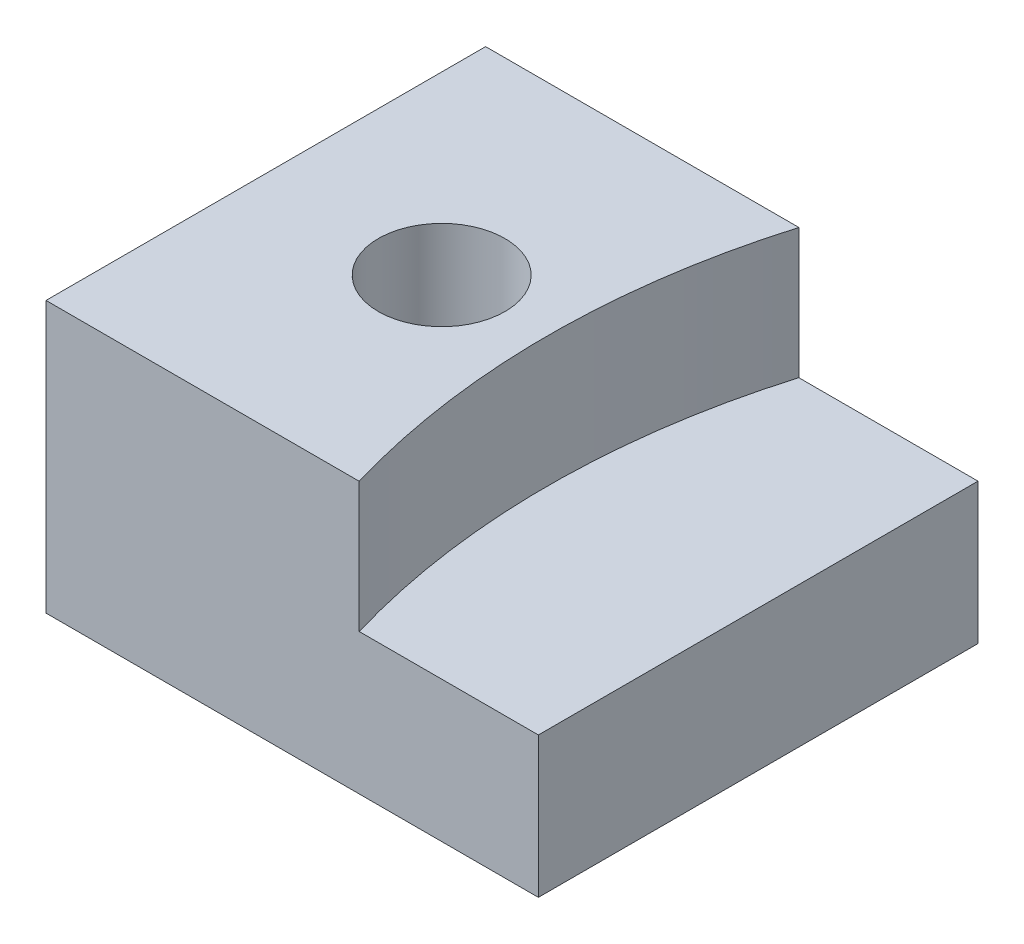
ISO-10303-21;
HEADER;
FILE_DESCRIPTION(('STEP AP214'),'2;1');
FILE_NAME('part.step','',(''),(''),'','','');
FILE_SCHEMA(('AUTOMOTIVE_DESIGN { 1 0 10303 214 1 1 1 1 }'));
ENDSEC;
DATA;
#1=APPLICATION_CONTEXT('core data for automotive mechanical design processes');
#2=APPLICATION_PROTOCOL_DEFINITION('international standard','automotive_design',2000,#1);
#3=PRODUCT_CONTEXT('',#1,'mechanical');
#4=PRODUCT('Part','Part','',(#3));
#5=PRODUCT_RELATED_PRODUCT_CATEGORY('part','',(#4));
#6=PRODUCT_DEFINITION_FORMATION('','',#4);
#7=PRODUCT_DEFINITION_CONTEXT('part definition',#1,'design');
#8=PRODUCT_DEFINITION('design','',#6,#7);
#9=PRODUCT_DEFINITION_SHAPE('','',#8);
#10=(LENGTH_UNIT() NAMED_UNIT(*) SI_UNIT(.MILLI.,.METRE.));
#11=(NAMED_UNIT(*) PLANE_ANGLE_UNIT() SI_UNIT($,.RADIAN.));
#12=(NAMED_UNIT(*) SI_UNIT($,.STERADIAN.) SOLID_ANGLE_UNIT());
#13=UNCERTAINTY_MEASURE_WITH_UNIT(LENGTH_MEASURE(1.E-05),#10,'distance_accuracy_value','');
#14=(GEOMETRIC_REPRESENTATION_CONTEXT(3) GLOBAL_UNCERTAINTY_ASSIGNED_CONTEXT((#13)) GLOBAL_UNIT_ASSIGNED_CONTEXT((#10,
#11,#12)) REPRESENTATION_CONTEXT('',''));
#15=CARTESIAN_POINT('',(0.,0.,0.));
#16=DIRECTION('',(0.,0.,1.));
#17=DIRECTION('',(1.,0.,0.));
#18=AXIS2_PLACEMENT_3D('',#15,#16,#17);
#19=CARTESIAN_POINT('',(0.,2.,0.));
#20=DIRECTION('',(0.,-1.,0.));
#21=DIRECTION('',(0.,0.,-1.));
#22=AXIS2_PLACEMENT_3D('',#19,#20,#21);
#23=PLANE('',#22);
#24=CARTESIAN_POINT('',(12.5,2.,0.));
#25=DIRECTION('',(0.,-1.,0.));
#26=DIRECTION('',(0.,0.,-1.));
#27=AXIS2_PLACEMENT_3D('',#24,#25,#26);
#28=CIRCLE('',#27,11.);
#29=CARTESIAN_POINT('',(1.95322916718108,2.,3.125));
#30=VERTEX_POINT('',#29);
#31=CARTESIAN_POINT('',(1.95322916718107,2.,-3.12499999999999));
#32=VERTEX_POINT('',#31);
#33=EDGE_CURVE('E50',#30,#32,#28,.T.);
#34=ORIENTED_EDGE('',*,*,#33,.F.);
#35=DIRECTION('',(1.,0.,0.));
#36=VECTOR('',#35,1.);
#37=CARTESIAN_POINT('',(-2.5,2.,3.125));
#38=LINE('',#37,#36);
#39=CARTESIAN_POINT('',(4.5,2.,3.125));
#40=VERTEX_POINT('',#39);
#41=EDGE_CURVE('E88',#30,#40,#38,.T.);
#42=ORIENTED_EDGE('',*,*,#41,.T.);
#43=DIRECTION('',(0.,0.,-1.));
#44=VECTOR('',#43,1.);
#45=CARTESIAN_POINT('',(4.5,2.,3.125));
#46=LINE('',#45,#44);
#47=CARTESIAN_POINT('',(4.5,2.,-3.125));
#48=VERTEX_POINT('',#47);
#49=EDGE_CURVE('E56',#40,#48,#46,.T.);
#50=ORIENTED_EDGE('',*,*,#49,.T.);
#51=DIRECTION('',(-1.,0.,0.));
#52=VECTOR('',#51,1.);
#53=CARTESIAN_POINT('',(-2.5,2.,-3.125));
#54=LINE('',#53,#52);
#55=EDGE_CURVE('E98',#48,#32,#54,.T.);
#56=ORIENTED_EDGE('',*,*,#55,.T.);
#57=EDGE_LOOP('',(#34,#42,#50,#56));
#58=FACE_BOUND('',#57,.T.);
#59=ADVANCED_FACE('F35',(#58),#23,.F.);
#60=CARTESIAN_POINT('',(0.,0.,0.));
#61=DIRECTION('',(0.,-1.,0.));
#62=DIRECTION('',(0.,0.,-1.));
#63=AXIS2_PLACEMENT_3D('',#60,#61,#62);
#64=PLANE('',#63);
#65=DIRECTION('',(0.,0.,1.));
#66=VECTOR('',#65,1.);
#67=CARTESIAN_POINT('',(-2.5,0.,3.125));
#68=LINE('',#67,#66);
#69=CARTESIAN_POINT('',(-2.5,0.,-3.125));
#70=VERTEX_POINT('',#69);
#71=CARTESIAN_POINT('',(-2.5,0.,3.125));
#72=VERTEX_POINT('',#71);
#73=EDGE_CURVE('E94',#70,#72,#68,.T.);
#74=ORIENTED_EDGE('',*,*,#73,.F.);
#75=DIRECTION('',(-1.,0.,0.));
#76=VECTOR('',#75,1.);
#77=CARTESIAN_POINT('',(-2.5,0.,-3.125));
#78=LINE('',#77,#76);
#79=CARTESIAN_POINT('',(4.5,0.,-3.125));
#80=VERTEX_POINT('',#79);
#81=EDGE_CURVE('E76',#80,#70,#78,.T.);
#82=ORIENTED_EDGE('',*,*,#81,.F.);
#83=DIRECTION('',(0.,0.,-1.));
#84=VECTOR('',#83,1.);
#85=CARTESIAN_POINT('',(4.5,0.,3.125));
#86=LINE('',#85,#84);
#87=CARTESIAN_POINT('',(4.5,0.,3.125));
#88=VERTEX_POINT('',#87);
#89=EDGE_CURVE('E89',#88,#80,#86,.T.);
#90=ORIENTED_EDGE('',*,*,#89,.F.);
#91=DIRECTION('',(1.,0.,0.));
#92=VECTOR('',#91,1.);
#93=CARTESIAN_POINT('',(-2.5,0.,3.125));
#94=LINE('',#93,#92);
#95=EDGE_CURVE('E102',#72,#88,#94,.T.);
#96=ORIENTED_EDGE('',*,*,#95,.F.);
#97=EDGE_LOOP('',(#74,#82,#90,#96));
#98=FACE_BOUND('',#97,.T.);
#99=CARTESIAN_POINT('',(0.,0.,0.));
#100=DIRECTION('',(0.,1.,0.));
#101=DIRECTION('',(0.,0.,1.));
#102=AXIS2_PLACEMENT_3D('',#99,#100,#101);
#103=CIRCLE('',#102,0.9);
#104=CARTESIAN_POINT('',(0.,0.,0.9));
#105=VERTEX_POINT('',#104);
#106=EDGE_CURVE('E103',#105,#105,#103,.T.);
#107=ORIENTED_EDGE('',*,*,#106,.T.);
#108=EDGE_LOOP('',(#107));
#109=FACE_BOUND('',#108,.T.);
#110=ADVANCED_FACE('F100',(#98,#109),#64,.T.);
#111=CARTESIAN_POINT('',(-2.5,2.,3.125));
#112=DIRECTION('',(1.,0.,0.));
#113=DIRECTION('',(0.,0.,-1.));
#114=AXIS2_PLACEMENT_3D('',#111,#112,#113);
#115=PLANE('',#114);
#116=ORIENTED_EDGE('',*,*,#73,.T.);
#117=DIRECTION('',(0.,-1.,0.));
#118=VECTOR('',#117,1.);
#119=CARTESIAN_POINT('',(-2.5,2.,3.125));
#120=LINE('',#119,#118);
#121=CARTESIAN_POINT('',(-2.5,3.85,3.125));
#122=VERTEX_POINT('',#121);
#123=EDGE_CURVE('E11',#122,#72,#120,.T.);
#124=ORIENTED_EDGE('',*,*,#123,.F.);
#125=DIRECTION('',(0.,0.,1.));
#126=VECTOR('',#125,1.);
#127=CARTESIAN_POINT('',(-2.5,3.85,-3.125));
#128=LINE('',#127,#126);
#129=CARTESIAN_POINT('',(-2.5,3.85,-3.125));
#130=VERTEX_POINT('',#129);
#131=EDGE_CURVE('E96',#130,#122,#128,.T.);
#132=ORIENTED_EDGE('',*,*,#131,.F.);
#133=DIRECTION('',(0.,-1.,0.));
#134=VECTOR('',#133,1.);
#135=CARTESIAN_POINT('',(-2.5,2.,-3.125));
#136=LINE('',#135,#134);
#137=EDGE_CURVE('E81',#130,#70,#136,.T.);
#138=ORIENTED_EDGE('',*,*,#137,.T.);
#139=EDGE_LOOP('',(#116,#124,#132,#138));
#140=FACE_BOUND('',#139,.T.);
#141=ADVANCED_FACE('F37',(#140),#115,.F.);
#142=CARTESIAN_POINT('',(-2.5,2.,3.125));
#143=DIRECTION('',(0.,0.,-1.));
#144=DIRECTION('',(-1.,0.,0.));
#145=AXIS2_PLACEMENT_3D('',#142,#143,#144);
#146=PLANE('',#145);
#147=ORIENTED_EDGE('',*,*,#95,.T.);
#148=DIRECTION('',(0.,-1.,0.));
#149=VECTOR('',#148,1.);
#150=CARTESIAN_POINT('',(4.5,2.,3.125));
#151=LINE('',#150,#149);
#152=EDGE_CURVE('E43',#40,#88,#151,.T.);
#153=ORIENTED_EDGE('',*,*,#152,.F.);
#154=ORIENTED_EDGE('',*,*,#41,.F.);
#155=DIRECTION('',(0.,-1.,0.));
#156=VECTOR('',#155,1.);
#157=CARTESIAN_POINT('',(1.95322916718108,3.85,3.125));
#158=LINE('',#157,#156);
#159=CARTESIAN_POINT('',(1.95322916718108,3.85,3.125));
#160=VERTEX_POINT('',#159);
#161=EDGE_CURVE('E107',#160,#30,#158,.T.);
#162=ORIENTED_EDGE('',*,*,#161,.F.);
#163=DIRECTION('',(1.,0.,0.));
#164=VECTOR('',#163,1.);
#165=CARTESIAN_POINT('',(1.95322916718108,3.85,3.125));
#166=LINE('',#165,#164);
#167=EDGE_CURVE('E124',#122,#160,#166,.T.);
#168=ORIENTED_EDGE('',*,*,#167,.F.);
#169=ORIENTED_EDGE('',*,*,#123,.T.);
#170=EDGE_LOOP('',(#147,#153,#154,#162,#168,#169));
#171=FACE_BOUND('',#170,.T.);
#172=ADVANCED_FACE('F118',(#171),#146,.F.);
#173=CARTESIAN_POINT('',(4.5,2.,3.125));
#174=DIRECTION('',(-1.,0.,0.));
#175=DIRECTION('',(0.,0.,1.));
#176=AXIS2_PLACEMENT_3D('',#173,#174,#175);
#177=PLANE('',#176);
#178=ORIENTED_EDGE('',*,*,#89,.T.);
#179=DIRECTION('',(0.,-1.,0.));
#180=VECTOR('',#179,1.);
#181=CARTESIAN_POINT('',(4.5,2.,-3.125));
#182=LINE('',#181,#180);
#183=EDGE_CURVE('E84',#48,#80,#182,.T.);
#184=ORIENTED_EDGE('',*,*,#183,.F.);
#185=ORIENTED_EDGE('',*,*,#49,.F.);
#186=ORIENTED_EDGE('',*,*,#152,.T.);
#187=EDGE_LOOP('',(#178,#184,#185,#186));
#188=FACE_BOUND('',#187,.T.);
#189=ADVANCED_FACE('F116',(#188),#177,.F.);
#190=CARTESIAN_POINT('',(-2.5,2.,-3.125));
#191=DIRECTION('',(0.,0.,1.));
#192=DIRECTION('',(1.,0.,0.));
#193=AXIS2_PLACEMENT_3D('',#190,#191,#192);
#194=PLANE('',#193);
#195=ORIENTED_EDGE('',*,*,#81,.T.);
#196=ORIENTED_EDGE('',*,*,#137,.F.);
#197=DIRECTION('',(-1.,0.,0.));
#198=VECTOR('',#197,1.);
#199=CARTESIAN_POINT('',(-2.5,3.85,-3.125));
#200=LINE('',#199,#198);
#201=CARTESIAN_POINT('',(1.95322916718107,3.85,-3.12499999999999));
#202=VERTEX_POINT('',#201);
#203=EDGE_CURVE('E131',#202,#130,#200,.T.);
#204=ORIENTED_EDGE('',*,*,#203,.F.);
#205=DIRECTION('',(0.,-1.,0.));
#206=VECTOR('',#205,1.);
#207=CARTESIAN_POINT('',(1.95322916718107,3.85,-3.12499999999999));
#208=LINE('',#207,#206);
#209=EDGE_CURVE('E139',#202,#32,#208,.T.);
#210=ORIENTED_EDGE('',*,*,#209,.T.);
#211=ORIENTED_EDGE('',*,*,#55,.F.);
#212=ORIENTED_EDGE('',*,*,#183,.T.);
#213=EDGE_LOOP('',(#195,#196,#204,#210,#211,#212));
#214=FACE_BOUND('',#213,.T.);
#215=ADVANCED_FACE('F78',(#214),#194,.F.);
#216=CARTESIAN_POINT('',(0.,2.,0.));
#217=DIRECTION('',(0.,-1.,0.));
#218=DIRECTION('',(0.,0.,-1.));
#219=AXIS2_PLACEMENT_3D('',#216,#217,#218);
#220=CYLINDRICAL_SURFACE('',#219,0.9);
#221=ORIENTED_EDGE('',*,*,#106,.F.);
#222=EDGE_LOOP('',(#221));
#223=FACE_BOUND('',#222,.T.);
#224=CARTESIAN_POINT('',(0.,3.85,0.));
#225=DIRECTION('',(0.,1.,0.));
#226=DIRECTION('',(0.,0.,1.));
#227=AXIS2_PLACEMENT_3D('',#224,#225,#226);
#228=CIRCLE('',#227,0.9);
#229=CARTESIAN_POINT('',(0.,3.85,0.9));
#230=VERTEX_POINT('',#229);
#231=EDGE_CURVE('E141',#230,#230,#228,.T.);
#232=ORIENTED_EDGE('',*,*,#231,.T.);
#233=EDGE_LOOP('',(#232));
#234=FACE_BOUND('',#233,.T.);
#235=ADVANCED_FACE('F158',(#223,#234),#220,.F.);
#236=CARTESIAN_POINT('',(12.5,3.85,0.));
#237=DIRECTION('',(0.,-1.,0.));
#238=DIRECTION('',(0.,0.,-1.));
#239=AXIS2_PLACEMENT_3D('',#236,#237,#238);
#240=PLANE('',#239);
#241=ORIENTED_EDGE('',*,*,#203,.T.);
#242=ORIENTED_EDGE('',*,*,#131,.T.);
#243=ORIENTED_EDGE('',*,*,#167,.T.);
#244=CARTESIAN_POINT('',(12.5,3.85,0.));
#245=DIRECTION('',(0.,-1.,0.));
#246=DIRECTION('',(0.,0.,-1.));
#247=AXIS2_PLACEMENT_3D('',#244,#245,#246);
#248=CIRCLE('',#247,11.);
#249=EDGE_CURVE('E133',#160,#202,#248,.T.);
#250=ORIENTED_EDGE('',*,*,#249,.T.);
#251=EDGE_LOOP('',(#241,#242,#243,#250));
#252=FACE_BOUND('',#251,.T.);
#253=ORIENTED_EDGE('',*,*,#231,.F.);
#254=EDGE_LOOP('',(#253));
#255=FACE_BOUND('',#254,.T.);
#256=ADVANCED_FACE('F128',(#252,#255),#240,.F.);
#257=CARTESIAN_POINT('',(12.5,3.85,0.));
#258=DIRECTION('',(0.,-1.,0.));
#259=DIRECTION('',(0.,0.,-1.));
#260=AXIS2_PLACEMENT_3D('',#257,#258,#259);
#261=CYLINDRICAL_SURFACE('',#260,11.);
#262=ORIENTED_EDGE('',*,*,#33,.T.);
#263=ORIENTED_EDGE('',*,*,#209,.F.);
#264=ORIENTED_EDGE('',*,*,#249,.F.);
#265=ORIENTED_EDGE('',*,*,#161,.T.);
#266=EDGE_LOOP('',(#262,#263,#264,#265));
#267=FACE_BOUND('',#266,.T.);
#268=ADVANCED_FACE('F148',(#267),#261,.F.);
#269=CLOSED_SHELL('',(#59,#110,#141,#172,#189,#215,#235,#256,#268));
#270=MANIFOLD_SOLID_BREP('B2',#269);
#271=ADVANCED_BREP_SHAPE_REPRESENTATION('',(#18,#270),#14);
#272=SHAPE_DEFINITION_REPRESENTATION(#9,#271);
ENDSEC;
END-ISO-10303-21;
